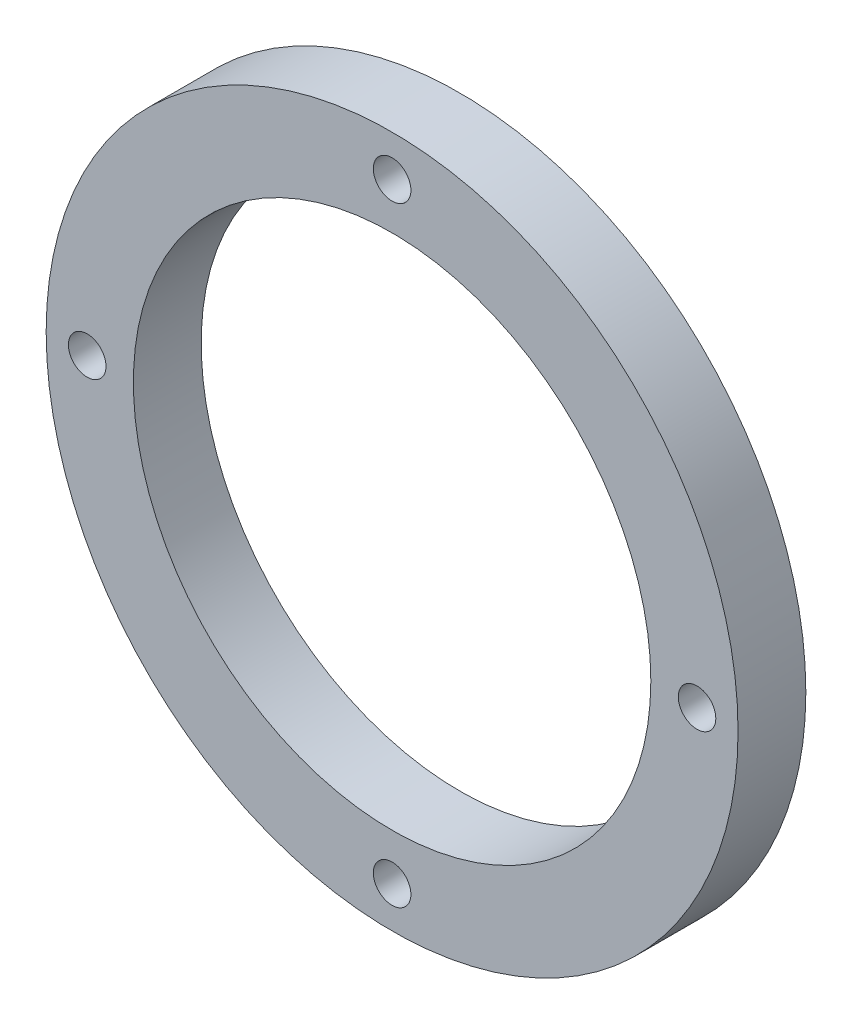
ISO-10303-21;
HEADER;
FILE_DESCRIPTION(('STEP AP214'),'2;1');
FILE_NAME('part.step','',(''),(''),'','','');
FILE_SCHEMA(('AUTOMOTIVE_DESIGN { 1 0 10303 214 1 1 1 1 }'));
ENDSEC;
DATA;
#1=APPLICATION_CONTEXT('core data for automotive mechanical design processes');
#2=APPLICATION_PROTOCOL_DEFINITION('international standard','automotive_design',2000,#1);
#3=PRODUCT_CONTEXT('',#1,'mechanical');
#4=PRODUCT('Part','Part','',(#3));
#5=PRODUCT_RELATED_PRODUCT_CATEGORY('part','',(#4));
#6=PRODUCT_DEFINITION_FORMATION('','',#4);
#7=PRODUCT_DEFINITION_CONTEXT('part definition',#1,'design');
#8=PRODUCT_DEFINITION('design','',#6,#7);
#9=PRODUCT_DEFINITION_SHAPE('','',#8);
#10=(LENGTH_UNIT() NAMED_UNIT(*) SI_UNIT(.MILLI.,.METRE.));
#11=(NAMED_UNIT(*) PLANE_ANGLE_UNIT() SI_UNIT($,.RADIAN.));
#12=(NAMED_UNIT(*) SI_UNIT($,.STERADIAN.) SOLID_ANGLE_UNIT());
#13=UNCERTAINTY_MEASURE_WITH_UNIT(LENGTH_MEASURE(1.E-05),#10,'distance_accuracy_value','');
#14=(GEOMETRIC_REPRESENTATION_CONTEXT(3) GLOBAL_UNCERTAINTY_ASSIGNED_CONTEXT((#13)) GLOBAL_UNIT_ASSIGNED_CONTEXT((#10,
#11,#12)) REPRESENTATION_CONTEXT('',''));
#15=CARTESIAN_POINT('',(0.,0.,0.));
#16=DIRECTION('',(0.,0.,1.));
#17=DIRECTION('',(1.,0.,0.));
#18=AXIS2_PLACEMENT_3D('',#15,#16,#17);
#19=CARTESIAN_POINT('',(0.,0.,9.1694));
#20=DIRECTION('',(0.,0.,1.));
#21=DIRECTION('',(1.,0.,0.));
#22=AXIS2_PLACEMENT_3D('',#19,#20,#21);
#23=PLANE('',#22);
#24=CARTESIAN_POINT('',(1.18202685202724E-12,-41.25,9.1694));
#25=DIRECTION('',(0.,0.,1.));
#26=DIRECTION('',(1.,0.,0.));
#27=AXIS2_PLACEMENT_3D('',#24,#25,#26);
#28=CIRCLE('',#27,2.54);
#29=CARTESIAN_POINT('',(2.54000000000118,-41.25,9.1694));
#30=VERTEX_POINT('',#29);
#31=EDGE_CURVE('E72',#30,#30,#28,.T.);
#32=ORIENTED_EDGE('',*,*,#31,.F.);
#33=EDGE_LOOP('',(#32));
#34=FACE_BOUND('',#33,.T.);
#35=CARTESIAN_POINT('',(0.,41.25000005,9.1694));
#36=DIRECTION('',(0.,0.,1.));
#37=DIRECTION('',(1.,0.,0.));
#38=AXIS2_PLACEMENT_3D('',#35,#36,#37);
#39=CIRCLE('',#38,2.54);
#40=CARTESIAN_POINT('',(2.54,41.25000005,9.1694));
#41=VERTEX_POINT('',#40);
#42=EDGE_CURVE('E56',#41,#41,#39,.T.);
#43=ORIENTED_EDGE('',*,*,#42,.F.);
#44=EDGE_LOOP('',(#43));
#45=FACE_BOUND('',#44,.T.);
#46=CARTESIAN_POINT('',(0.,0.,9.1694));
#47=DIRECTION('',(0.,0.,1.));
#48=DIRECTION('',(1.,0.,0.));
#49=AXIS2_PLACEMENT_3D('',#46,#47,#48);
#50=CIRCLE('',#49,46.8);
#51=CARTESIAN_POINT('',(46.8,0.,9.1694));
#52=VERTEX_POINT('',#51);
#53=EDGE_CURVE('E10',#52,#52,#50,.T.);
#54=ORIENTED_EDGE('',*,*,#53,.T.);
#55=EDGE_LOOP('',(#54));
#56=FACE_BOUND('',#55,.T.);
#57=CARTESIAN_POINT('',(0.,0.,9.1694));
#58=DIRECTION('',(0.,0.,1.));
#59=DIRECTION('',(1.,0.,0.));
#60=AXIS2_PLACEMENT_3D('',#57,#58,#59);
#61=CIRCLE('',#60,35.);
#62=CARTESIAN_POINT('',(35.,0.,9.1694));
#63=VERTEX_POINT('',#62);
#64=EDGE_CURVE('E50',#63,#63,#61,.T.);
#65=ORIENTED_EDGE('',*,*,#64,.F.);
#66=EDGE_LOOP('',(#65));
#67=FACE_BOUND('',#66,.T.);
#68=CARTESIAN_POINT('',(41.25,1.15000781177469E-12,9.1694));
#69=DIRECTION('',(0.,0.,1.));
#70=DIRECTION('',(1.,0.,0.));
#71=AXIS2_PLACEMENT_3D('',#68,#69,#70);
#72=CIRCLE('',#71,2.54);
#73=CARTESIAN_POINT('',(43.79,1.15000781177469E-12,9.1694));
#74=VERTEX_POINT('',#73);
#75=EDGE_CURVE('E64',#74,#74,#72,.T.);
#76=ORIENTED_EDGE('',*,*,#75,.F.);
#77=EDGE_LOOP('',(#76));
#78=FACE_BOUND('',#77,.T.);
#79=CARTESIAN_POINT('',(-41.25,0.,9.1694));
#80=DIRECTION('',(0.,0.,1.));
#81=DIRECTION('',(1.,0.,0.));
#82=AXIS2_PLACEMENT_3D('',#79,#80,#81);
#83=CIRCLE('',#82,2.54);
#84=CARTESIAN_POINT('',(-38.71,0.,9.1694));
#85=VERTEX_POINT('',#84);
#86=EDGE_CURVE('E80',#85,#85,#83,.T.);
#87=ORIENTED_EDGE('',*,*,#86,.F.);
#88=EDGE_LOOP('',(#87));
#89=FACE_BOUND('',#88,.T.);
#90=ADVANCED_FACE('F37',(#34,#45,#56,#67,#78,#89),#23,.T.);
#91=CARTESIAN_POINT('',(0.,0.,0.));
#92=DIRECTION('',(0.,0.,1.));
#93=DIRECTION('',(1.,0.,0.));
#94=AXIS2_PLACEMENT_3D('',#91,#92,#93);
#95=PLANE('',#94);
#96=CARTESIAN_POINT('',(0.,0.,0.));
#97=DIRECTION('',(0.,0.,1.));
#98=DIRECTION('',(1.,0.,0.));
#99=AXIS2_PLACEMENT_3D('',#96,#97,#98);
#100=CIRCLE('',#99,46.8);
#101=CARTESIAN_POINT('',(46.8,0.,0.));
#102=VERTEX_POINT('',#101);
#103=EDGE_CURVE('E41',#102,#102,#100,.T.);
#104=ORIENTED_EDGE('',*,*,#103,.F.);
#105=EDGE_LOOP('',(#104));
#106=FACE_BOUND('',#105,.T.);
#107=CARTESIAN_POINT('',(0.,0.,0.));
#108=DIRECTION('',(0.,0.,1.));
#109=DIRECTION('',(1.,0.,0.));
#110=AXIS2_PLACEMENT_3D('',#107,#108,#109);
#111=CIRCLE('',#110,35.);
#112=CARTESIAN_POINT('',(35.,0.,0.));
#113=VERTEX_POINT('',#112);
#114=EDGE_CURVE('E52',#113,#113,#111,.T.);
#115=ORIENTED_EDGE('',*,*,#114,.T.);
#116=EDGE_LOOP('',(#115));
#117=FACE_BOUND('',#116,.T.);
#118=CARTESIAN_POINT('',(0.,41.25000005,0.));
#119=DIRECTION('',(0.,0.,1.));
#120=DIRECTION('',(1.,0.,0.));
#121=AXIS2_PLACEMENT_3D('',#118,#119,#120);
#122=CIRCLE('',#121,2.54);
#123=CARTESIAN_POINT('',(2.54,41.25000005,0.));
#124=VERTEX_POINT('',#123);
#125=EDGE_CURVE('E60',#124,#124,#122,.T.);
#126=ORIENTED_EDGE('',*,*,#125,.T.);
#127=EDGE_LOOP('',(#126));
#128=FACE_BOUND('',#127,.T.);
#129=CARTESIAN_POINT('',(41.25,1.15000781177469E-12,0.));
#130=DIRECTION('',(0.,0.,1.));
#131=DIRECTION('',(1.,0.,0.));
#132=AXIS2_PLACEMENT_3D('',#129,#130,#131);
#133=CIRCLE('',#132,2.54);
#134=CARTESIAN_POINT('',(43.79,1.15000781177469E-12,0.));
#135=VERTEX_POINT('',#134);
#136=EDGE_CURVE('E68',#135,#135,#133,.T.);
#137=ORIENTED_EDGE('',*,*,#136,.T.);
#138=EDGE_LOOP('',(#137));
#139=FACE_BOUND('',#138,.T.);
#140=CARTESIAN_POINT('',(1.18202685202724E-12,-41.25,0.));
#141=DIRECTION('',(0.,0.,1.));
#142=DIRECTION('',(1.,0.,0.));
#143=AXIS2_PLACEMENT_3D('',#140,#141,#142);
#144=CIRCLE('',#143,2.54);
#145=CARTESIAN_POINT('',(2.54000000000118,-41.25,0.));
#146=VERTEX_POINT('',#145);
#147=EDGE_CURVE('E76',#146,#146,#144,.T.);
#148=ORIENTED_EDGE('',*,*,#147,.T.);
#149=EDGE_LOOP('',(#148));
#150=FACE_BOUND('',#149,.T.);
#151=CARTESIAN_POINT('',(-41.25,0.,0.));
#152=DIRECTION('',(0.,0.,1.));
#153=DIRECTION('',(1.,0.,0.));
#154=AXIS2_PLACEMENT_3D('',#151,#152,#153);
#155=CIRCLE('',#154,2.54);
#156=CARTESIAN_POINT('',(-38.71,0.,0.));
#157=VERTEX_POINT('',#156);
#158=EDGE_CURVE('E84',#157,#157,#155,.T.);
#159=ORIENTED_EDGE('',*,*,#158,.T.);
#160=EDGE_LOOP('',(#159));
#161=FACE_BOUND('',#160,.T.);
#162=ADVANCED_FACE('F96',(#106,#117,#128,#139,#150,#161),#95,.F.);
#163=CARTESIAN_POINT('',(0.,0.,9.1694));
#164=DIRECTION('',(0.,0.,-1.));
#165=DIRECTION('',(-1.,0.,0.));
#166=AXIS2_PLACEMENT_3D('',#163,#164,#165);
#167=CYLINDRICAL_SURFACE('',#166,46.8);
#168=ORIENTED_EDGE('',*,*,#53,.F.);
#169=EDGE_LOOP('',(#168));
#170=FACE_BOUND('',#169,.T.);
#171=ORIENTED_EDGE('',*,*,#103,.T.);
#172=EDGE_LOOP('',(#171));
#173=FACE_BOUND('',#172,.T.);
#174=ADVANCED_FACE('F39',(#170,#173),#167,.T.);
#175=CARTESIAN_POINT('',(0.,0.,9.1694));
#176=DIRECTION('',(0.,0.,-1.));
#177=DIRECTION('',(-1.,0.,0.));
#178=AXIS2_PLACEMENT_3D('',#175,#176,#177);
#179=CYLINDRICAL_SURFACE('',#178,35.);
#180=ORIENTED_EDGE('',*,*,#64,.T.);
#181=EDGE_LOOP('',(#180));
#182=FACE_BOUND('',#181,.T.);
#183=ORIENTED_EDGE('',*,*,#114,.F.);
#184=EDGE_LOOP('',(#183));
#185=FACE_BOUND('',#184,.T.);
#186=ADVANCED_FACE('F106',(#182,#185),#179,.F.);
#187=CARTESIAN_POINT('',(0.,41.25000005,9.1694));
#188=DIRECTION('',(0.,0.,-1.));
#189=DIRECTION('',(-1.,0.,0.));
#190=AXIS2_PLACEMENT_3D('',#187,#188,#189);
#191=CYLINDRICAL_SURFACE('',#190,2.54);
#192=ORIENTED_EDGE('',*,*,#42,.T.);
#193=EDGE_LOOP('',(#192));
#194=FACE_BOUND('',#193,.T.);
#195=ORIENTED_EDGE('',*,*,#125,.F.);
#196=EDGE_LOOP('',(#195));
#197=FACE_BOUND('',#196,.T.);
#198=ADVANCED_FACE('F109',(#194,#197),#191,.F.);
#199=CARTESIAN_POINT('',(41.25,1.15000781177469E-12,9.1694));
#200=DIRECTION('',(0.,0.,-1.));
#201=DIRECTION('',(-1.,0.,0.));
#202=AXIS2_PLACEMENT_3D('',#199,#200,#201);
#203=CYLINDRICAL_SURFACE('',#202,2.54);
#204=ORIENTED_EDGE('',*,*,#75,.T.);
#205=EDGE_LOOP('',(#204));
#206=FACE_BOUND('',#205,.T.);
#207=ORIENTED_EDGE('',*,*,#136,.F.);
#208=EDGE_LOOP('',(#207));
#209=FACE_BOUND('',#208,.T.);
#210=ADVANCED_FACE('F113',(#206,#209),#203,.F.);
#211=CARTESIAN_POINT('',(1.18202685202724E-12,-41.25,9.1694));
#212=DIRECTION('',(0.,0.,-1.));
#213=DIRECTION('',(-1.,0.,0.));
#214=AXIS2_PLACEMENT_3D('',#211,#212,#213);
#215=CYLINDRICAL_SURFACE('',#214,2.54);
#216=ORIENTED_EDGE('',*,*,#31,.T.);
#217=EDGE_LOOP('',(#216));
#218=FACE_BOUND('',#217,.T.);
#219=ORIENTED_EDGE('',*,*,#147,.F.);
#220=EDGE_LOOP('',(#219));
#221=FACE_BOUND('',#220,.T.);
#222=ADVANCED_FACE('F117',(#218,#221),#215,.F.);
#223=CARTESIAN_POINT('',(-41.25,0.,9.1694));
#224=DIRECTION('',(0.,0.,-1.));
#225=DIRECTION('',(-1.,0.,0.));
#226=AXIS2_PLACEMENT_3D('',#223,#224,#225);
#227=CYLINDRICAL_SURFACE('',#226,2.54);
#228=ORIENTED_EDGE('',*,*,#86,.T.);
#229=EDGE_LOOP('',(#228));
#230=FACE_BOUND('',#229,.T.);
#231=ORIENTED_EDGE('',*,*,#158,.F.);
#232=EDGE_LOOP('',(#231));
#233=FACE_BOUND('',#232,.T.);
#234=ADVANCED_FACE('F92',(#230,#233),#227,.F.);
#235=CLOSED_SHELL('',(#90,#162,#174,#186,#198,#210,#222,#234));
#236=MANIFOLD_SOLID_BREP('B2',#235);
#237=ADVANCED_BREP_SHAPE_REPRESENTATION('',(#18,#236),#14);
#238=SHAPE_DEFINITION_REPRESENTATION(#9,#237);
ENDSEC;
END-ISO-10303-21;
